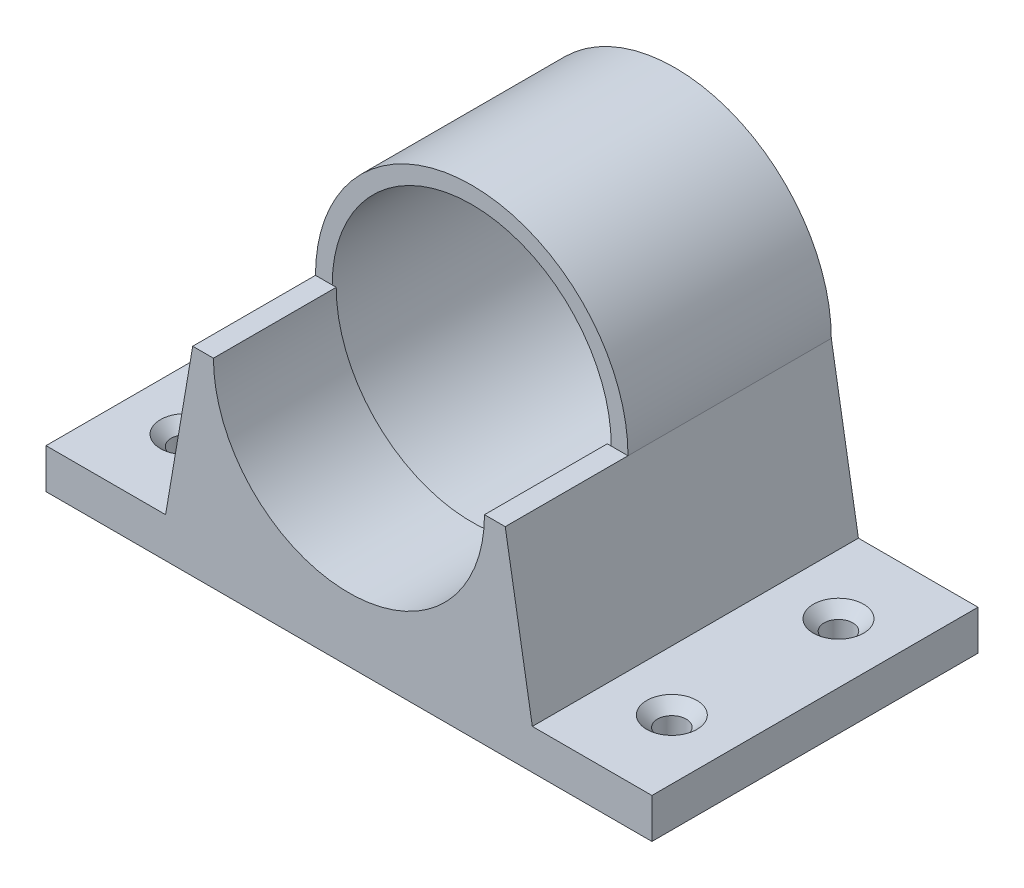
ISO-10303-21;
HEADER;
FILE_DESCRIPTION(('STEP AP214'),'2;1');
FILE_NAME('part.step','',(''),(''),'','','');
FILE_SCHEMA(('AUTOMOTIVE_DESIGN { 1 0 10303 214 1 1 1 1 }'));
ENDSEC;
DATA;
#1=APPLICATION_CONTEXT('core data for automotive mechanical design processes');
#2=APPLICATION_PROTOCOL_DEFINITION('international standard','automotive_design',2000,#1);
#3=PRODUCT_CONTEXT('',#1,'mechanical');
#4=PRODUCT('Part','Part','',(#3));
#5=PRODUCT_RELATED_PRODUCT_CATEGORY('part','',(#4));
#6=PRODUCT_DEFINITION_FORMATION('','',#4);
#7=PRODUCT_DEFINITION_CONTEXT('part definition',#1,'design');
#8=PRODUCT_DEFINITION('design','',#6,#7);
#9=PRODUCT_DEFINITION_SHAPE('','',#8);
#10=(LENGTH_UNIT() NAMED_UNIT(*) SI_UNIT(.MILLI.,.METRE.));
#11=(NAMED_UNIT(*) PLANE_ANGLE_UNIT() SI_UNIT($,.RADIAN.));
#12=(NAMED_UNIT(*) SI_UNIT($,.STERADIAN.) SOLID_ANGLE_UNIT());
#13=UNCERTAINTY_MEASURE_WITH_UNIT(LENGTH_MEASURE(1.E-05),#10,'distance_accuracy_value','');
#14=(GEOMETRIC_REPRESENTATION_CONTEXT(3) GLOBAL_UNCERTAINTY_ASSIGNED_CONTEXT((#13)) GLOBAL_UNIT_ASSIGNED_CONTEXT((#10,
#11,#12)) REPRESENTATION_CONTEXT('',''));
#15=CARTESIAN_POINT('',(0.,0.,0.));
#16=DIRECTION('',(0.,0.,1.));
#17=DIRECTION('',(1.,0.,0.));
#18=AXIS2_PLACEMENT_3D('',#15,#16,#17);
#19=CARTESIAN_POINT('',(0.,18.1533956791324,0.));
#20=DIRECTION('',(0.,0.,-1.));
#21=DIRECTION('',(-1.,0.,0.));
#22=AXIS2_PLACEMENT_3D('',#19,#20,#21);
#23=PLANE('',#22);
#24=CARTESIAN_POINT('',(0.,18.1533956791324,0.));
#25=DIRECTION('',(0.,0.,1.));
#26=DIRECTION('',(1.,0.,0.));
#27=AXIS2_PLACEMENT_3D('',#24,#25,#26);
#28=CIRCLE('',#27,17.5);
#29=CARTESIAN_POINT('',(17.5,18.1533956791324,0.));
#30=VERTEX_POINT('',#29);
#31=CARTESIAN_POINT('',(-17.5,18.1533956791324,0.));
#32=VERTEX_POINT('',#31);
#33=EDGE_CURVE('E253',#30,#32,#28,.T.);
#34=ORIENTED_EDGE('',*,*,#33,.F.);
#35=DIRECTION('',(1.,0.,0.));
#36=VECTOR('',#35,1.);
#37=CARTESIAN_POINT('',(0.,18.1533956791324,0.));
#38=LINE('',#37,#36);
#39=CARTESIAN_POINT('',(19.6,18.1533956791324,0.));
#40=VERTEX_POINT('',#39);
#41=EDGE_CURVE('E174',#30,#40,#38,.T.);
#42=ORIENTED_EDGE('',*,*,#41,.T.);
#43=CARTESIAN_POINT('',(0.,18.1533956791324,0.));
#44=DIRECTION('',(0.,0.,1.));
#45=DIRECTION('',(1.,0.,0.));
#46=AXIS2_PLACEMENT_3D('',#43,#44,#45);
#47=CIRCLE('',#46,19.6);
#48=CARTESIAN_POINT('',(-19.6,18.1533956791324,0.));
#49=VERTEX_POINT('',#48);
#50=EDGE_CURVE('E53',#40,#49,#47,.T.);
#51=ORIENTED_EDGE('',*,*,#50,.T.);
#52=DIRECTION('',(1.,0.,0.));
#53=VECTOR('',#52,1.);
#54=CARTESIAN_POINT('',(0.,18.1533956791324,0.));
#55=LINE('',#54,#53);
#56=EDGE_CURVE('E64',#49,#32,#55,.T.);
#57=ORIENTED_EDGE('',*,*,#56,.T.);
#58=EDGE_LOOP('',(#34,#42,#51,#57));
#59=FACE_BOUND('',#58,.T.);
#60=ADVANCED_FACE('F49',(#59),#23,.F.);
#61=CARTESIAN_POINT('',(0.,18.1533956791324,-25.5));
#62=DIRECTION('',(0.,0.,1.));
#63=DIRECTION('',(1.,0.,0.));
#64=AXIS2_PLACEMENT_3D('',#61,#62,#63);
#65=CYLINDRICAL_SURFACE('',#64,19.6);
#66=DIRECTION('',(0.,0.,-1.));
#67=VECTOR('',#66,1.);
#68=CARTESIAN_POINT('',(-19.6,18.1533956791324,15.4));
#69=LINE('',#68,#67);
#70=CARTESIAN_POINT('',(-19.6,18.1533956791324,-25.5));
#71=VERTEX_POINT('',#70);
#72=EDGE_CURVE('E254',#49,#71,#69,.T.);
#73=ORIENTED_EDGE('',*,*,#72,.F.);
#74=ORIENTED_EDGE('',*,*,#50,.F.);
#75=DIRECTION('',(0.,0.,-1.));
#76=VECTOR('',#75,1.);
#77=CARTESIAN_POINT('',(19.6,18.1533956791324,15.4));
#78=LINE('',#77,#76);
#79=CARTESIAN_POINT('',(19.6,18.1533956791324,-25.5));
#80=VERTEX_POINT('',#79);
#81=EDGE_CURVE('E250',#40,#80,#78,.T.);
#82=ORIENTED_EDGE('',*,*,#81,.T.);
#83=CARTESIAN_POINT('',(0.,18.1533956791324,-25.5));
#84=DIRECTION('',(0.,0.,-1.));
#85=DIRECTION('',(-1.,0.,0.));
#86=AXIS2_PLACEMENT_3D('',#83,#84,#85);
#87=CIRCLE('',#86,19.6);
#88=EDGE_CURVE('E12',#71,#80,#87,.T.);
#89=ORIENTED_EDGE('',*,*,#88,.F.);
#90=EDGE_LOOP('',(#73,#74,#82,#89));
#91=FACE_BOUND('',#90,.T.);
#92=ADVANCED_FACE('F51',(#91),#65,.T.);
#93=CARTESIAN_POINT('',(0.,18.1533956791324,-25.5));
#94=DIRECTION('',(0.,0.,-1.));
#95=DIRECTION('',(-1.,0.,0.));
#96=AXIS2_PLACEMENT_3D('',#93,#94,#95);
#97=PLANE('',#96);
#98=CARTESIAN_POINT('',(0.,18.1533956791324,-25.5));
#99=DIRECTION('',(0.,0.,1.));
#100=DIRECTION('',(1.,0.,0.));
#101=AXIS2_PLACEMENT_3D('',#98,#99,#100);
#102=CIRCLE('',#101,17.5);
#103=CARTESIAN_POINT('',(17.5,18.1533956791324,-25.5));
#104=VERTEX_POINT('',#103);
#105=EDGE_CURVE('E269',#104,#104,#102,.T.);
#106=ORIENTED_EDGE('',*,*,#105,.T.);
#107=EDGE_LOOP('',(#106));
#108=FACE_BOUND('',#107,.T.);
#109=ORIENTED_EDGE('',*,*,#88,.T.);
#110=DIRECTION('',(0.167595493933869,-0.985855846669817,0.));
#111=VECTOR('',#110,1.);
#112=CARTESIAN_POINT('',(19.6,18.1533956791324,-25.5));
#113=LINE('',#112,#111);
#114=CARTESIAN_POINT('',(23.,-1.84660432086758,-25.5));
#115=VERTEX_POINT('',#114);
#116=EDGE_CURVE('E214',#80,#115,#113,.T.);
#117=ORIENTED_EDGE('',*,*,#116,.T.);
#118=DIRECTION('',(1.,0.,0.));
#119=VECTOR('',#118,1.);
#120=CARTESIAN_POINT('',(23.,-1.84660432086758,-25.5));
#121=LINE('',#120,#119);
#122=CARTESIAN_POINT('',(38.,-1.84660432086758,-25.5));
#123=VERTEX_POINT('',#122);
#124=EDGE_CURVE('E217',#115,#123,#121,.T.);
#125=ORIENTED_EDGE('',*,*,#124,.T.);
#126=DIRECTION('',(0.,-1.,0.));
#127=VECTOR('',#126,1.);
#128=CARTESIAN_POINT('',(38.,-1.84660432086758,-25.5));
#129=LINE('',#128,#127);
#130=CARTESIAN_POINT('',(38.,-6.84660432086758,-25.5));
#131=VERTEX_POINT('',#130);
#132=EDGE_CURVE('E220',#123,#131,#129,.T.);
#133=ORIENTED_EDGE('',*,*,#132,.T.);
#134=DIRECTION('',(1.,0.,0.));
#135=VECTOR('',#134,1.);
#136=CARTESIAN_POINT('',(-38.,-6.84660432086758,-25.5));
#137=LINE('',#136,#135);
#138=CARTESIAN_POINT('',(-38.,-6.84660432086758,-25.5));
#139=VERTEX_POINT('',#138);
#140=EDGE_CURVE('E223',#139,#131,#137,.T.);
#141=ORIENTED_EDGE('',*,*,#140,.F.);
#142=DIRECTION('',(0.,-1.,0.));
#143=VECTOR('',#142,1.);
#144=CARTESIAN_POINT('',(-38.,-1.84660432086758,-25.5));
#145=LINE('',#144,#143);
#146=CARTESIAN_POINT('',(-38.,-1.84660432086758,-25.5));
#147=VERTEX_POINT('',#146);
#148=EDGE_CURVE('E226',#147,#139,#145,.T.);
#149=ORIENTED_EDGE('',*,*,#148,.F.);
#150=DIRECTION('',(-1.,0.,0.));
#151=VECTOR('',#150,1.);
#152=CARTESIAN_POINT('',(-23.,-1.84660432086758,-25.5));
#153=LINE('',#152,#151);
#154=CARTESIAN_POINT('',(-23.,-1.84660432086758,-25.5));
#155=VERTEX_POINT('',#154);
#156=EDGE_CURVE('E229',#155,#147,#153,.T.);
#157=ORIENTED_EDGE('',*,*,#156,.F.);
#158=DIRECTION('',(0.167595493933869,0.985855846669817,0.));
#159=VECTOR('',#158,1.);
#160=CARTESIAN_POINT('',(-23.,-1.84660432086758,-25.5));
#161=LINE('',#160,#159);
#162=EDGE_CURVE('E232',#155,#71,#161,.T.);
#163=ORIENTED_EDGE('',*,*,#162,.T.);
#164=EDGE_LOOP('',(#109,#117,#125,#133,#141,#149,#157,#163));
#165=FACE_BOUND('',#164,.T.);
#166=ADVANCED_FACE('F307',(#108,#165),#97,.T.);
#167=CARTESIAN_POINT('',(0.,18.1533956791324,-25.5));
#168=DIRECTION('',(0.,0.,1.));
#169=DIRECTION('',(1.,0.,0.));
#170=AXIS2_PLACEMENT_3D('',#167,#168,#169);
#171=CYLINDRICAL_SURFACE('',#170,17.5);
#172=ORIENTED_EDGE('',*,*,#105,.F.);
#173=EDGE_LOOP('',(#172));
#174=FACE_BOUND('',#173,.T.);
#175=ORIENTED_EDGE('',*,*,#33,.T.);
#176=CARTESIAN_POINT('',(0.,18.1533956791324,0.));
#177=DIRECTION('',(0.,0.,1.));
#178=DIRECTION('',(1.,0.,0.));
#179=AXIS2_PLACEMENT_3D('',#176,#177,#178);
#180=CIRCLE('',#179,17.5);
#181=EDGE_CURVE('E70',#30,#32,#180,.F.);
#182=ORIENTED_EDGE('',*,*,#181,.F.);
#183=EDGE_LOOP('',(#175,#182));
#184=FACE_BOUND('',#183,.T.);
#185=ADVANCED_FACE('F272',(#174,#184),#171,.F.);
#186=CARTESIAN_POINT('',(-23.,-1.84660432086758,15.4));
#187=DIRECTION('',(-0.985855846669818,0.167595493933869,0.));
#188=DIRECTION('',(-0.167595493933869,-0.985855846669818,0.));
#189=AXIS2_PLACEMENT_3D('',#186,#187,#188);
#190=PLANE('',#189);
#191=CARTESIAN_POINT('',(-19.6,18.1533956791324,15.4));
#192=VERTEX_POINT('',#191);
#193=EDGE_CURVE('E251',#192,#49,#69,.T.);
#194=ORIENTED_EDGE('',*,*,#193,.T.);
#195=ORIENTED_EDGE('',*,*,#72,.T.);
#196=ORIENTED_EDGE('',*,*,#162,.F.);
#197=DIRECTION('',(0.,0.,-1.));
#198=VECTOR('',#197,1.);
#199=CARTESIAN_POINT('',(-23.,-1.84660432086758,15.4));
#200=LINE('',#199,#198);
#201=CARTESIAN_POINT('',(-23.,-1.84660432086758,15.4));
#202=VERTEX_POINT('',#201);
#203=EDGE_CURVE('E255',#202,#155,#200,.T.);
#204=ORIENTED_EDGE('',*,*,#203,.F.);
#205=DIRECTION('',(0.167595493933869,0.985855846669817,0.));
#206=VECTOR('',#205,1.);
#207=CARTESIAN_POINT('',(-23.,-1.84660432086758,15.4));
#208=LINE('',#207,#206);
#209=EDGE_CURVE('E248',#202,#192,#208,.T.);
#210=ORIENTED_EDGE('',*,*,#209,.T.);
#211=EDGE_LOOP('',(#194,#195,#196,#204,#210));
#212=FACE_BOUND('',#211,.T.);
#213=ADVANCED_FACE('F283',(#212),#190,.T.);
#214=CARTESIAN_POINT('',(-23.,-1.84660432086758,15.4));
#215=DIRECTION('',(0.,-1.,0.));
#216=DIRECTION('',(1.,0.,0.));
#217=AXIS2_PLACEMENT_3D('',#214,#215,#216);
#218=PLANE('',#217);
#219=CARTESIAN_POINT('',(-30.5,-1.84660432086758,-15.5));
#220=DIRECTION('',(0.,1.,0.));
#221=DIRECTION('',(0.,0.,1.));
#222=AXIS2_PLACEMENT_3D('',#219,#220,#221);
#223=CIRCLE('',#222,3.15);
#224=CARTESIAN_POINT('',(-30.5,-1.84660432086758,-12.35));
#225=VERTEX_POINT('',#224);
#226=EDGE_CURVE('E196',#225,#225,#223,.T.);
#227=ORIENTED_EDGE('',*,*,#226,.F.);
#228=EDGE_LOOP('',(#227));
#229=FACE_BOUND('',#228,.T.);
#230=CARTESIAN_POINT('',(-30.5,-1.84660432086758,5.4));
#231=DIRECTION('',(0.,1.,0.));
#232=DIRECTION('',(0.,0.,1.));
#233=AXIS2_PLACEMENT_3D('',#230,#231,#232);
#234=CIRCLE('',#233,3.15);
#235=CARTESIAN_POINT('',(-30.5,-1.84660432086758,8.55));
#236=VERTEX_POINT('',#235);
#237=EDGE_CURVE('E205',#236,#236,#234,.T.);
#238=ORIENTED_EDGE('',*,*,#237,.F.);
#239=EDGE_LOOP('',(#238));
#240=FACE_BOUND('',#239,.T.);
#241=ORIENTED_EDGE('',*,*,#203,.T.);
#242=ORIENTED_EDGE('',*,*,#156,.T.);
#243=DIRECTION('',(0.,0.,-1.));
#244=VECTOR('',#243,1.);
#245=CARTESIAN_POINT('',(-38.,-1.84660432086758,15.4));
#246=LINE('',#245,#244);
#247=CARTESIAN_POINT('',(-38.,-1.84660432086758,15.4));
#248=VERTEX_POINT('',#247);
#249=EDGE_CURVE('E257',#248,#147,#246,.T.);
#250=ORIENTED_EDGE('',*,*,#249,.F.);
#251=DIRECTION('',(-1.,0.,0.));
#252=VECTOR('',#251,1.);
#253=CARTESIAN_POINT('',(-23.,-1.84660432086758,15.4));
#254=LINE('',#253,#252);
#255=EDGE_CURVE('E246',#202,#248,#254,.T.);
#256=ORIENTED_EDGE('',*,*,#255,.F.);
#257=EDGE_LOOP('',(#241,#242,#250,#256));
#258=FACE_BOUND('',#257,.T.);
#259=ADVANCED_FACE('F288',(#229,#240,#258),#218,.F.);
#260=CARTESIAN_POINT('',(-38.,-1.84660432086758,15.4));
#261=DIRECTION('',(1.,0.,0.));
#262=DIRECTION('',(0.,0.,-1.));
#263=AXIS2_PLACEMENT_3D('',#260,#261,#262);
#264=PLANE('',#263);
#265=ORIENTED_EDGE('',*,*,#249,.T.);
#266=ORIENTED_EDGE('',*,*,#148,.T.);
#267=DIRECTION('',(0.,0.,-1.));
#268=VECTOR('',#267,1.);
#269=CARTESIAN_POINT('',(-38.,-6.84660432086758,15.4));
#270=LINE('',#269,#268);
#271=CARTESIAN_POINT('',(-38.,-6.84660432086758,15.4));
#272=VERTEX_POINT('',#271);
#273=EDGE_CURVE('E259',#272,#139,#270,.T.);
#274=ORIENTED_EDGE('',*,*,#273,.F.);
#275=DIRECTION('',(0.,-1.,0.));
#276=VECTOR('',#275,1.);
#277=CARTESIAN_POINT('',(-38.,-1.84660432086758,15.4));
#278=LINE('',#277,#276);
#279=EDGE_CURVE('E244',#248,#272,#278,.T.);
#280=ORIENTED_EDGE('',*,*,#279,.F.);
#281=EDGE_LOOP('',(#265,#266,#274,#280));
#282=FACE_BOUND('',#281,.T.);
#283=ADVANCED_FACE('F293',(#282),#264,.F.);
#284=CARTESIAN_POINT('',(-38.,-6.84660432086758,15.4));
#285=DIRECTION('',(0.,1.,0.));
#286=DIRECTION('',(0.,0.,1.));
#287=AXIS2_PLACEMENT_3D('',#284,#285,#286);
#288=PLANE('',#287);
#289=CARTESIAN_POINT('',(30.5,-6.84660432086761,5.4));
#290=DIRECTION('',(0.,1.,0.));
#291=DIRECTION('',(0.,0.,1.));
#292=AXIS2_PLACEMENT_3D('',#289,#290,#291);
#293=CIRCLE('',#292,1.8);
#294=CARTESIAN_POINT('',(30.5,-6.84660432086761,7.2));
#295=VERTEX_POINT('',#294);
#296=EDGE_CURVE('E184',#295,#295,#293,.T.);
#297=ORIENTED_EDGE('',*,*,#296,.T.);
#298=EDGE_LOOP('',(#297));
#299=FACE_BOUND('',#298,.T.);
#300=CARTESIAN_POINT('',(30.5,-6.84660432086761,-15.5));
#301=DIRECTION('',(0.,1.,0.));
#302=DIRECTION('',(0.,0.,1.));
#303=AXIS2_PLACEMENT_3D('',#300,#301,#302);
#304=CIRCLE('',#303,1.8);
#305=CARTESIAN_POINT('',(30.5,-6.84660432086761,-13.7));
#306=VERTEX_POINT('',#305);
#307=EDGE_CURVE('E193',#306,#306,#304,.T.);
#308=ORIENTED_EDGE('',*,*,#307,.T.);
#309=EDGE_LOOP('',(#308));
#310=FACE_BOUND('',#309,.T.);
#311=CARTESIAN_POINT('',(-30.5,-6.8466043208676,-15.5));
#312=DIRECTION('',(0.,1.,0.));
#313=DIRECTION('',(0.,0.,1.));
#314=AXIS2_PLACEMENT_3D('',#311,#312,#313);
#315=CIRCLE('',#314,1.8);
#316=CARTESIAN_POINT('',(-30.5,-6.8466043208676,-13.7));
#317=VERTEX_POINT('',#316);
#318=EDGE_CURVE('E202',#317,#317,#315,.T.);
#319=ORIENTED_EDGE('',*,*,#318,.T.);
#320=EDGE_LOOP('',(#319));
#321=FACE_BOUND('',#320,.T.);
#322=CARTESIAN_POINT('',(-30.5,-6.8466043208676,5.4));
#323=DIRECTION('',(0.,1.,0.));
#324=DIRECTION('',(0.,0.,1.));
#325=AXIS2_PLACEMENT_3D('',#322,#323,#324);
#326=CIRCLE('',#325,1.8);
#327=CARTESIAN_POINT('',(-30.5,-6.8466043208676,7.2));
#328=VERTEX_POINT('',#327);
#329=EDGE_CURVE('E211',#328,#328,#326,.T.);
#330=ORIENTED_EDGE('',*,*,#329,.T.);
#331=EDGE_LOOP('',(#330));
#332=FACE_BOUND('',#331,.T.);
#333=ORIENTED_EDGE('',*,*,#273,.T.);
#334=ORIENTED_EDGE('',*,*,#140,.T.);
#335=DIRECTION('',(0.,0.,-1.));
#336=VECTOR('',#335,1.);
#337=CARTESIAN_POINT('',(38.,-6.84660432086758,15.4));
#338=LINE('',#337,#336);
#339=CARTESIAN_POINT('',(38.,-6.84660432086758,15.4));
#340=VERTEX_POINT('',#339);
#341=EDGE_CURVE('E261',#340,#131,#338,.T.);
#342=ORIENTED_EDGE('',*,*,#341,.F.);
#343=DIRECTION('',(1.,0.,0.));
#344=VECTOR('',#343,1.);
#345=CARTESIAN_POINT('',(-38.,-6.84660432086758,15.4));
#346=LINE('',#345,#344);
#347=EDGE_CURVE('E242',#272,#340,#346,.T.);
#348=ORIENTED_EDGE('',*,*,#347,.F.);
#349=EDGE_LOOP('',(#333,#334,#342,#348));
#350=FACE_BOUND('',#349,.T.);
#351=ADVANCED_FACE('F298',(#299,#310,#321,#332,#350),#288,.F.);
#352=CARTESIAN_POINT('',(38.,-1.84660432086758,15.4));
#353=DIRECTION('',(1.,0.,0.));
#354=DIRECTION('',(0.,0.,-1.));
#355=AXIS2_PLACEMENT_3D('',#352,#353,#354);
#356=PLANE('',#355);
#357=ORIENTED_EDGE('',*,*,#341,.T.);
#358=ORIENTED_EDGE('',*,*,#132,.F.);
#359=DIRECTION('',(0.,0.,-1.));
#360=VECTOR('',#359,1.);
#361=CARTESIAN_POINT('',(38.,-1.84660432086758,15.4));
#362=LINE('',#361,#360);
#363=CARTESIAN_POINT('',(38.,-1.84660432086758,15.4));
#364=VERTEX_POINT('',#363);
#365=EDGE_CURVE('E263',#364,#123,#362,.T.);
#366=ORIENTED_EDGE('',*,*,#365,.F.);
#367=DIRECTION('',(0.,-1.,0.));
#368=VECTOR('',#367,1.);
#369=CARTESIAN_POINT('',(38.,-1.84660432086758,15.4));
#370=LINE('',#369,#368);
#371=EDGE_CURVE('E239',#364,#340,#370,.T.);
#372=ORIENTED_EDGE('',*,*,#371,.T.);
#373=EDGE_LOOP('',(#357,#358,#366,#372));
#374=FACE_BOUND('',#373,.T.);
#375=ADVANCED_FACE('F302',(#374),#356,.T.);
#376=CARTESIAN_POINT('',(23.,-1.84660432086758,15.4));
#377=DIRECTION('',(0.,1.,0.));
#378=DIRECTION('',(-1.,0.,0.));
#379=AXIS2_PLACEMENT_3D('',#376,#377,#378);
#380=PLANE('',#379);
#381=CARTESIAN_POINT('',(30.5,-1.84660432086758,5.4));
#382=DIRECTION('',(0.,1.,0.));
#383=DIRECTION('',(0.,0.,1.));
#384=AXIS2_PLACEMENT_3D('',#381,#382,#383);
#385=CIRCLE('',#384,3.15);
#386=CARTESIAN_POINT('',(30.5,-1.84660432086758,8.55));
#387=VERTEX_POINT('',#386);
#388=EDGE_CURVE('E178',#387,#387,#385,.T.);
#389=ORIENTED_EDGE('',*,*,#388,.F.);
#390=EDGE_LOOP('',(#389));
#391=FACE_BOUND('',#390,.T.);
#392=CARTESIAN_POINT('',(30.5,-1.84660432086758,-15.5));
#393=DIRECTION('',(0.,1.,0.));
#394=DIRECTION('',(0.,0.,1.));
#395=AXIS2_PLACEMENT_3D('',#392,#393,#394);
#396=CIRCLE('',#395,3.15);
#397=CARTESIAN_POINT('',(30.5,-1.84660432086758,-12.35));
#398=VERTEX_POINT('',#397);
#399=EDGE_CURVE('E187',#398,#398,#396,.T.);
#400=ORIENTED_EDGE('',*,*,#399,.F.);
#401=EDGE_LOOP('',(#400));
#402=FACE_BOUND('',#401,.T.);
#403=ORIENTED_EDGE('',*,*,#365,.T.);
#404=ORIENTED_EDGE('',*,*,#124,.F.);
#405=DIRECTION('',(0.,0.,-1.));
#406=VECTOR('',#405,1.);
#407=CARTESIAN_POINT('',(23.,-1.84660432086758,15.4));
#408=LINE('',#407,#406);
#409=CARTESIAN_POINT('',(23.,-1.84660432086758,15.4));
#410=VERTEX_POINT('',#409);
#411=EDGE_CURVE('E265',#410,#115,#408,.T.);
#412=ORIENTED_EDGE('',*,*,#411,.F.);
#413=DIRECTION('',(1.,0.,0.));
#414=VECTOR('',#413,1.);
#415=CARTESIAN_POINT('',(23.,-1.84660432086758,15.4));
#416=LINE('',#415,#414);
#417=EDGE_CURVE('E236',#410,#364,#416,.T.);
#418=ORIENTED_EDGE('',*,*,#417,.T.);
#419=EDGE_LOOP('',(#403,#404,#412,#418));
#420=FACE_BOUND('',#419,.T.);
#421=ADVANCED_FACE('F305',(#391,#402,#420),#380,.T.);
#422=CARTESIAN_POINT('',(19.6,18.1533956791324,15.4));
#423=DIRECTION('',(0.985855846669818,0.167595493933869,0.));
#424=DIRECTION('',(-0.167595493933869,0.985855846669818,0.));
#425=AXIS2_PLACEMENT_3D('',#422,#423,#424);
#426=PLANE('',#425);
#427=ORIENTED_EDGE('',*,*,#411,.T.);
#428=ORIENTED_EDGE('',*,*,#116,.F.);
#429=ORIENTED_EDGE('',*,*,#81,.F.);
#430=CARTESIAN_POINT('',(19.6,18.1533956791324,15.4));
#431=VERTEX_POINT('',#430);
#432=EDGE_CURVE('E267',#431,#40,#78,.T.);
#433=ORIENTED_EDGE('',*,*,#432,.F.);
#434=DIRECTION('',(0.167595493933869,-0.985855846669817,0.));
#435=VECTOR('',#434,1.);
#436=CARTESIAN_POINT('',(19.6,18.1533956791324,15.4));
#437=LINE('',#436,#435);
#438=EDGE_CURVE('E165',#431,#410,#437,.T.);
#439=ORIENTED_EDGE('',*,*,#438,.T.);
#440=EDGE_LOOP('',(#427,#428,#429,#433,#439));
#441=FACE_BOUND('',#440,.T.);
#442=ADVANCED_FACE('F312',(#441),#426,.T.);
#443=CARTESIAN_POINT('',(0.,18.1533956791324,15.4));
#444=DIRECTION('',(0.,0.,1.));
#445=DIRECTION('',(1.,0.,0.));
#446=AXIS2_PLACEMENT_3D('',#443,#444,#445);
#447=PLANE('',#446);
#448=ORIENTED_EDGE('',*,*,#438,.F.);
#449=DIRECTION('',(1.,0.,0.));
#450=VECTOR('',#449,1.);
#451=CARTESIAN_POINT('',(0.,18.1533956791324,15.4));
#452=LINE('',#451,#450);
#453=CARTESIAN_POINT('',(17.,18.1533956791324,15.4));
#454=VERTEX_POINT('',#453);
#455=EDGE_CURVE('E144',#454,#431,#452,.T.);
#456=ORIENTED_EDGE('',*,*,#455,.F.);
#457=CARTESIAN_POINT('',(0.,18.1533956791324,15.4));
#458=DIRECTION('',(0.,0.,1.));
#459=DIRECTION('',(1.,0.,0.));
#460=AXIS2_PLACEMENT_3D('',#457,#458,#459);
#461=CIRCLE('',#460,17.);
#462=CARTESIAN_POINT('',(-17.,18.1533956791324,15.4));
#463=VERTEX_POINT('',#462);
#464=EDGE_CURVE('E154',#454,#463,#461,.F.);
#465=ORIENTED_EDGE('',*,*,#464,.T.);
#466=DIRECTION('',(1.,0.,0.));
#467=VECTOR('',#466,1.);
#468=CARTESIAN_POINT('',(0.,18.1533956791324,15.4));
#469=LINE('',#468,#467);
#470=EDGE_CURVE('E160',#192,#463,#469,.T.);
#471=ORIENTED_EDGE('',*,*,#470,.F.);
#472=ORIENTED_EDGE('',*,*,#209,.F.);
#473=ORIENTED_EDGE('',*,*,#255,.T.);
#474=ORIENTED_EDGE('',*,*,#279,.T.);
#475=ORIENTED_EDGE('',*,*,#347,.T.);
#476=ORIENTED_EDGE('',*,*,#371,.F.);
#477=ORIENTED_EDGE('',*,*,#417,.F.);
#478=EDGE_LOOP('',(#448,#456,#465,#471,#472,#473,#474,#475,#476,#477));
#479=FACE_BOUND('',#478,.T.);
#480=ADVANCED_FACE('F162',(#479),#447,.T.);
#481=CARTESIAN_POINT('',(-30.5,-1.84660432086758,5.4));
#482=DIRECTION('',(0.,1.,0.));
#483=DIRECTION('',(0.,0.,1.));
#484=AXIS2_PLACEMENT_3D('',#481,#482,#483);
#485=CYLINDRICAL_SURFACE('',#484,1.8);
#486=ORIENTED_EDGE('',*,*,#329,.F.);
#487=EDGE_LOOP('',(#486));
#488=FACE_BOUND('',#487,.T.);
#489=CARTESIAN_POINT('',(-30.5,-3.19660432086758,5.4));
#490=DIRECTION('',(0.,1.,0.));
#491=DIRECTION('',(0.,0.,1.));
#492=AXIS2_PLACEMENT_3D('',#489,#490,#491);
#493=CIRCLE('',#492,1.8);
#494=CARTESIAN_POINT('',(-30.5,-3.19660432086758,7.2));
#495=VERTEX_POINT('',#494);
#496=EDGE_CURVE('E208',#495,#495,#493,.T.);
#497=ORIENTED_EDGE('',*,*,#496,.T.);
#498=EDGE_LOOP('',(#497));
#499=FACE_BOUND('',#498,.T.);
#500=ADVANCED_FACE('F345',(#488,#499),#485,.F.);
#501=CARTESIAN_POINT('',(-30.5,-1.84660432086758,5.4));
#502=DIRECTION('',(0.,1.,0.));
#503=DIRECTION('',(0.,0.,1.));
#504=AXIS2_PLACEMENT_3D('',#501,#502,#503);
#505=CONICAL_SURFACE('',#504,3.15,0.785398163397448);
#506=ORIENTED_EDGE('',*,*,#496,.F.);
#507=EDGE_LOOP('',(#506));
#508=FACE_BOUND('',#507,.T.);
#509=ORIENTED_EDGE('',*,*,#237,.T.);
#510=EDGE_LOOP('',(#509));
#511=FACE_BOUND('',#510,.T.);
#512=ADVANCED_FACE('F348',(#508,#511),#505,.F.);
#513=CARTESIAN_POINT('',(-30.5,-1.84660432086758,-15.5));
#514=DIRECTION('',(0.,1.,0.));
#515=DIRECTION('',(0.,0.,1.));
#516=AXIS2_PLACEMENT_3D('',#513,#514,#515);
#517=CYLINDRICAL_SURFACE('',#516,1.8);
#518=ORIENTED_EDGE('',*,*,#318,.F.);
#519=EDGE_LOOP('',(#518));
#520=FACE_BOUND('',#519,.T.);
#521=CARTESIAN_POINT('',(-30.5,-3.19660432086758,-15.5));
#522=DIRECTION('',(0.,1.,0.));
#523=DIRECTION('',(0.,0.,1.));
#524=AXIS2_PLACEMENT_3D('',#521,#522,#523);
#525=CIRCLE('',#524,1.8);
#526=CARTESIAN_POINT('',(-30.5,-3.19660432086758,-13.7));
#527=VERTEX_POINT('',#526);
#528=EDGE_CURVE('E199',#527,#527,#525,.T.);
#529=ORIENTED_EDGE('',*,*,#528,.T.);
#530=EDGE_LOOP('',(#529));
#531=FACE_BOUND('',#530,.T.);
#532=ADVANCED_FACE('F352',(#520,#531),#517,.F.);
#533=CARTESIAN_POINT('',(-30.5,-1.84660432086758,-15.5));
#534=DIRECTION('',(0.,1.,0.));
#535=DIRECTION('',(0.,0.,1.));
#536=AXIS2_PLACEMENT_3D('',#533,#534,#535);
#537=CONICAL_SURFACE('',#536,3.15,0.785398163397448);
#538=ORIENTED_EDGE('',*,*,#528,.F.);
#539=EDGE_LOOP('',(#538));
#540=FACE_BOUND('',#539,.T.);
#541=ORIENTED_EDGE('',*,*,#226,.T.);
#542=EDGE_LOOP('',(#541));
#543=FACE_BOUND('',#542,.T.);
#544=ADVANCED_FACE('F356',(#540,#543),#537,.F.);
#545=CARTESIAN_POINT('',(30.5,-1.84660432086758,-15.5));
#546=DIRECTION('',(0.,1.,0.));
#547=DIRECTION('',(0.,0.,1.));
#548=AXIS2_PLACEMENT_3D('',#545,#546,#547);
#549=CYLINDRICAL_SURFACE('',#548,1.79999999999999);
#550=ORIENTED_EDGE('',*,*,#307,.F.);
#551=EDGE_LOOP('',(#550));
#552=FACE_BOUND('',#551,.T.);
#553=CARTESIAN_POINT('',(30.5,-3.19660432086759,-15.5));
#554=DIRECTION('',(0.,1.,0.));
#555=DIRECTION('',(0.,0.,1.));
#556=AXIS2_PLACEMENT_3D('',#553,#554,#555);
#557=CIRCLE('',#556,1.79999999999999);
#558=CARTESIAN_POINT('',(30.5,-3.19660432086759,-13.7));
#559=VERTEX_POINT('',#558);
#560=EDGE_CURVE('E190',#559,#559,#557,.T.);
#561=ORIENTED_EDGE('',*,*,#560,.T.);
#562=EDGE_LOOP('',(#561));
#563=FACE_BOUND('',#562,.T.);
#564=ADVANCED_FACE('F360',(#552,#563),#549,.F.);
#565=CARTESIAN_POINT('',(30.5,-1.84660432086758,-15.5));
#566=DIRECTION('',(0.,1.,0.));
#567=DIRECTION('',(0.,0.,1.));
#568=AXIS2_PLACEMENT_3D('',#565,#566,#567);
#569=CONICAL_SURFACE('',#568,3.15,0.78539816339745);
#570=ORIENTED_EDGE('',*,*,#560,.F.);
#571=EDGE_LOOP('',(#570));
#572=FACE_BOUND('',#571,.T.);
#573=ORIENTED_EDGE('',*,*,#399,.T.);
#574=EDGE_LOOP('',(#573));
#575=FACE_BOUND('',#574,.T.);
#576=ADVANCED_FACE('F364',(#572,#575),#569,.F.);
#577=CARTESIAN_POINT('',(30.5,-1.84660432086758,5.4));
#578=DIRECTION('',(0.,1.,0.));
#579=DIRECTION('',(0.,0.,1.));
#580=AXIS2_PLACEMENT_3D('',#577,#578,#579);
#581=CYLINDRICAL_SURFACE('',#580,1.79999999999999);
#582=ORIENTED_EDGE('',*,*,#296,.F.);
#583=EDGE_LOOP('',(#582));
#584=FACE_BOUND('',#583,.T.);
#585=CARTESIAN_POINT('',(30.5,-3.19660432086759,5.4));
#586=DIRECTION('',(0.,1.,0.));
#587=DIRECTION('',(0.,0.,1.));
#588=AXIS2_PLACEMENT_3D('',#585,#586,#587);
#589=CIRCLE('',#588,1.79999999999999);
#590=CARTESIAN_POINT('',(30.5,-3.19660432086759,7.19999999999998));
#591=VERTEX_POINT('',#590);
#592=EDGE_CURVE('E181',#591,#591,#589,.T.);
#593=ORIENTED_EDGE('',*,*,#592,.T.);
#594=EDGE_LOOP('',(#593));
#595=FACE_BOUND('',#594,.T.);
#596=ADVANCED_FACE('F368',(#584,#595),#581,.F.);
#597=CARTESIAN_POINT('',(30.5,-1.84660432086758,5.4));
#598=DIRECTION('',(0.,1.,0.));
#599=DIRECTION('',(0.,0.,1.));
#600=AXIS2_PLACEMENT_3D('',#597,#598,#599);
#601=CONICAL_SURFACE('',#600,3.15,0.785398163397453);
#602=ORIENTED_EDGE('',*,*,#592,.F.);
#603=EDGE_LOOP('',(#602));
#604=FACE_BOUND('',#603,.T.);
#605=ORIENTED_EDGE('',*,*,#388,.T.);
#606=EDGE_LOOP('',(#605));
#607=FACE_BOUND('',#606,.T.);
#608=ADVANCED_FACE('F372',(#604,#607),#601,.F.);
#609=CARTESIAN_POINT('',(0.,0.,0.));
#610=DIRECTION('',(0.,0.,1.));
#611=DIRECTION('',(1.,0.,0.));
#612=AXIS2_PLACEMENT_3D('',#609,#610,#611);
#613=PLANE('',#612);
#614=CARTESIAN_POINT('',(17.,18.1533956791324,0.));
#615=VERTEX_POINT('',#614);
#616=EDGE_CURVE('E147',#615,#30,#38,.T.);
#617=ORIENTED_EDGE('',*,*,#616,.T.);
#618=ORIENTED_EDGE('',*,*,#181,.T.);
#619=CARTESIAN_POINT('',(-17.,18.1533956791324,0.));
#620=VERTEX_POINT('',#619);
#621=EDGE_CURVE('E168',#32,#620,#55,.T.);
#622=ORIENTED_EDGE('',*,*,#621,.T.);
#623=CARTESIAN_POINT('',(0.,18.1533956791324,0.));
#624=DIRECTION('',(0.,0.,1.));
#625=DIRECTION('',(1.,0.,0.));
#626=AXIS2_PLACEMENT_3D('',#623,#624,#625);
#627=CIRCLE('',#626,17.);
#628=EDGE_CURVE('E173',#615,#620,#627,.F.);
#629=ORIENTED_EDGE('',*,*,#628,.F.);
#630=EDGE_LOOP('',(#617,#618,#622,#629));
#631=FACE_BOUND('',#630,.T.);
#632=ADVANCED_FACE('F275',(#631),#613,.F.);
#633=CARTESIAN_POINT('',(0.,18.1533956791324,15.4));
#634=DIRECTION('',(0.,1.,0.));
#635=DIRECTION('',(0.,0.,1.));
#636=AXIS2_PLACEMENT_3D('',#633,#634,#635);
#637=PLANE('',#636);
#638=ORIENTED_EDGE('',*,*,#616,.F.);
#639=DIRECTION('',(0.,0.,-1.));
#640=VECTOR('',#639,1.);
#641=CARTESIAN_POINT('',(17.,18.1533956791324,15.4));
#642=LINE('',#641,#640);
#643=EDGE_CURVE('E139',#454,#615,#642,.T.);
#644=ORIENTED_EDGE('',*,*,#643,.F.);
#645=ORIENTED_EDGE('',*,*,#455,.T.);
#646=ORIENTED_EDGE('',*,*,#432,.T.);
#647=ORIENTED_EDGE('',*,*,#41,.F.);
#648=EDGE_LOOP('',(#638,#644,#645,#646,#647));
#649=FACE_BOUND('',#648,.T.);
#650=ADVANCED_FACE('F141',(#649),#637,.T.);
#651=CARTESIAN_POINT('',(0.,18.1533956791324,15.4));
#652=DIRECTION('',(0.,0.,-1.));
#653=DIRECTION('',(-1.,0.,0.));
#654=AXIS2_PLACEMENT_3D('',#651,#652,#653);
#655=CYLINDRICAL_SURFACE('',#654,17.);
#656=ORIENTED_EDGE('',*,*,#628,.T.);
#657=DIRECTION('',(0.,0.,-1.));
#658=VECTOR('',#657,1.);
#659=CARTESIAN_POINT('',(-17.,18.1533956791324,15.4));
#660=LINE('',#659,#658);
#661=EDGE_CURVE('E151',#463,#620,#660,.T.);
#662=ORIENTED_EDGE('',*,*,#661,.F.);
#663=ORIENTED_EDGE('',*,*,#464,.F.);
#664=ORIENTED_EDGE('',*,*,#643,.T.);
#665=EDGE_LOOP('',(#656,#662,#663,#664));
#666=FACE_BOUND('',#665,.T.);
#667=ADVANCED_FACE('F155',(#666),#655,.F.);
#668=CARTESIAN_POINT('',(0.,18.1533956791324,15.4));
#669=DIRECTION('',(0.,1.,0.));
#670=DIRECTION('',(0.,0.,1.));
#671=AXIS2_PLACEMENT_3D('',#668,#669,#670);
#672=PLANE('',#671);
#673=ORIENTED_EDGE('',*,*,#56,.F.);
#674=ORIENTED_EDGE('',*,*,#193,.F.);
#675=ORIENTED_EDGE('',*,*,#470,.T.);
#676=ORIENTED_EDGE('',*,*,#661,.T.);
#677=ORIENTED_EDGE('',*,*,#621,.F.);
#678=EDGE_LOOP('',(#673,#674,#675,#676,#677));
#679=FACE_BOUND('',#678,.T.);
#680=ADVANCED_FACE('F277',(#679),#672,.T.);
#681=CLOSED_SHELL('',(#60,#92,#166,#185,#213,#259,#283,#351,#375,#421,#442,#480,#500,#512,#532,
#544,#564,#576,#596,#608,#632,#650,#667,#680));
#682=MANIFOLD_SOLID_BREP('B2',#681);
#683=ADVANCED_BREP_SHAPE_REPRESENTATION('',(#18,#682),#14);
#684=SHAPE_DEFINITION_REPRESENTATION(#9,#683);
ENDSEC;
END-ISO-10303-21;
